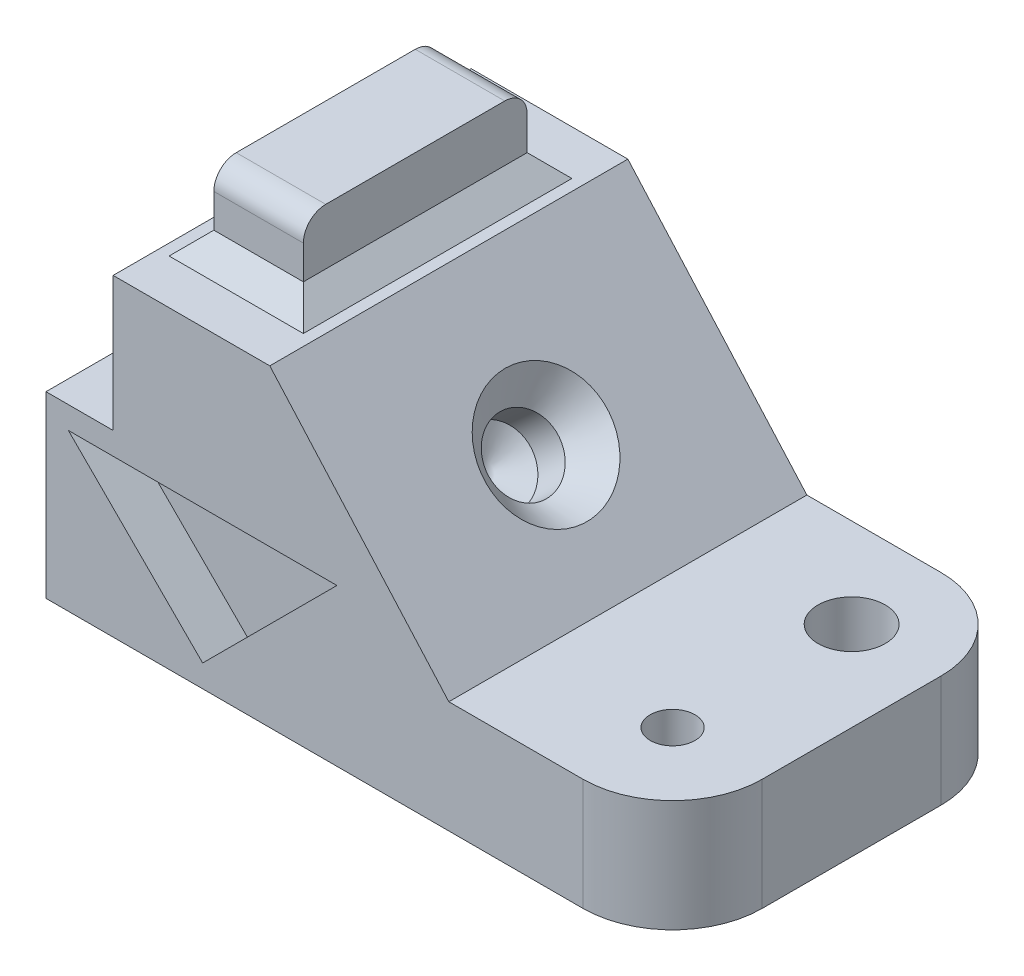
ISO-10303-21;
HEADER;
FILE_DESCRIPTION(('STEP AP214'),'2;1');
FILE_NAME('part.step','',(''),(''),'','','');
FILE_SCHEMA(('AUTOMOTIVE_DESIGN { 1 0 10303 214 1 1 1 1 }'));
ENDSEC;
DATA;
#1=APPLICATION_CONTEXT('core data for automotive mechanical design processes');
#2=APPLICATION_PROTOCOL_DEFINITION('international standard','automotive_design',2000,#1);
#3=PRODUCT_CONTEXT('',#1,'mechanical');
#4=PRODUCT('Part','Part','',(#3));
#5=PRODUCT_RELATED_PRODUCT_CATEGORY('part','',(#4));
#6=PRODUCT_DEFINITION_FORMATION('','',#4);
#7=PRODUCT_DEFINITION_CONTEXT('part definition',#1,'design');
#8=PRODUCT_DEFINITION('design','',#6,#7);
#9=PRODUCT_DEFINITION_SHAPE('','',#8);
#10=(LENGTH_UNIT() NAMED_UNIT(*) SI_UNIT(.MILLI.,.METRE.));
#11=(NAMED_UNIT(*) PLANE_ANGLE_UNIT() SI_UNIT($,.RADIAN.));
#12=(NAMED_UNIT(*) SI_UNIT($,.STERADIAN.) SOLID_ANGLE_UNIT());
#13=UNCERTAINTY_MEASURE_WITH_UNIT(LENGTH_MEASURE(1.E-05),#10,'distance_accuracy_value','');
#14=(GEOMETRIC_REPRESENTATION_CONTEXT(3) GLOBAL_UNCERTAINTY_ASSIGNED_CONTEXT((#13)) GLOBAL_UNIT_ASSIGNED_CONTEXT((#10,
#11,#12)) REPRESENTATION_CONTEXT('',''));
#15=CARTESIAN_POINT('',(0.,0.,0.));
#16=DIRECTION('',(0.,0.,1.));
#17=DIRECTION('',(1.,0.,0.));
#18=AXIS2_PLACEMENT_3D('',#15,#16,#17);
#19=CARTESIAN_POINT('',(177.8,0.,101.6));
#20=DIRECTION('',(0.,1.,0.));
#21=DIRECTION('',(-1.,0.,0.));
#22=AXIS2_PLACEMENT_3D('',#19,#20,#21);
#23=PLANE('',#22);
#24=CARTESIAN_POINT('',(152.4,0.,76.2));
#25=DIRECTION('',(0.,-1.,0.));
#26=DIRECTION('',(0.,0.,-1.));
#27=AXIS2_PLACEMENT_3D('',#24,#25,#26);
#28=CIRCLE('',#27,6.34999999999999);
#29=CARTESIAN_POINT('',(152.4,0.,69.85));
#30=VERTEX_POINT('',#29);
#31=EDGE_CURVE('E365',#30,#30,#28,.T.);
#32=ORIENTED_EDGE('',*,*,#31,.F.);
#33=EDGE_LOOP('',(#32));
#34=FACE_BOUND('',#33,.T.);
#35=CARTESIAN_POINT('',(152.4,0.,25.4));
#36=DIRECTION('',(0.,-1.,0.));
#37=DIRECTION('',(0.,0.,-1.));
#38=AXIS2_PLACEMENT_3D('',#35,#36,#37);
#39=CIRCLE('',#38,9.52499999999998);
#40=CARTESIAN_POINT('',(152.4,0.,15.875));
#41=VERTEX_POINT('',#40);
#42=EDGE_CURVE('E356',#41,#41,#39,.T.);
#43=ORIENTED_EDGE('',*,*,#42,.F.);
#44=EDGE_LOOP('',(#43));
#45=FACE_BOUND('',#44,.T.);
#46=DIRECTION('',(0.,0.,-1.));
#47=VECTOR('',#46,1.);
#48=CARTESIAN_POINT('',(177.8,0.,101.6));
#49=LINE('',#48,#47);
#50=CARTESIAN_POINT('',(177.8,0.,76.2));
#51=VERTEX_POINT('',#50);
#52=CARTESIAN_POINT('',(177.8,0.,25.4));
#53=VERTEX_POINT('',#52);
#54=EDGE_CURVE('E311',#51,#53,#49,.T.);
#55=ORIENTED_EDGE('',*,*,#54,.F.);
#56=CARTESIAN_POINT('',(152.4,0.,76.2));
#57=DIRECTION('',(0.,1.,0.));
#58=DIRECTION('',(-1.,0.,0.));
#59=AXIS2_PLACEMENT_3D('',#56,#57,#58);
#60=CIRCLE('',#59,25.4);
#61=CARTESIAN_POINT('',(152.4,0.,101.6));
#62=VERTEX_POINT('',#61);
#63=EDGE_CURVE('E49',#51,#62,#60,.F.);
#64=ORIENTED_EDGE('',*,*,#63,.T.);
#65=DIRECTION('',(1.,0.,0.));
#66=VECTOR('',#65,1.);
#67=CARTESIAN_POINT('',(177.8,0.,101.6));
#68=LINE('',#67,#66);
#69=CARTESIAN_POINT('',(0.,0.,101.6));
#70=VERTEX_POINT('',#69);
#71=EDGE_CURVE('E262',#70,#62,#68,.T.);
#72=ORIENTED_EDGE('',*,*,#71,.F.);
#73=DIRECTION('',(0.,0.,-1.));
#74=VECTOR('',#73,1.);
#75=CARTESIAN_POINT('',(0.,0.,101.6));
#76=LINE('',#75,#74);
#77=CARTESIAN_POINT('',(0.,0.,0.));
#78=VERTEX_POINT('',#77);
#79=EDGE_CURVE('E278',#70,#78,#76,.T.);
#80=ORIENTED_EDGE('',*,*,#79,.T.);
#81=DIRECTION('',(1.,0.,0.));
#82=VECTOR('',#81,1.);
#83=CARTESIAN_POINT('',(177.8,0.,0.));
#84=LINE('',#83,#82);
#85=CARTESIAN_POINT('',(152.4,0.,0.));
#86=VERTEX_POINT('',#85);
#87=EDGE_CURVE('E261',#78,#86,#84,.T.);
#88=ORIENTED_EDGE('',*,*,#87,.T.);
#89=CARTESIAN_POINT('',(152.4,0.,25.4));
#90=DIRECTION('',(0.,1.,0.));
#91=DIRECTION('',(-1.,0.,0.));
#92=AXIS2_PLACEMENT_3D('',#89,#90,#91);
#93=CIRCLE('',#92,25.4);
#94=EDGE_CURVE('E352',#86,#53,#93,.F.);
#95=ORIENTED_EDGE('',*,*,#94,.T.);
#96=EDGE_LOOP('',(#55,#64,#72,#80,#88,#95));
#97=FACE_BOUND('',#96,.T.);
#98=ADVANCED_FACE('F40',(#34,#45,#97),#23,.F.);
#99=CARTESIAN_POINT('',(177.8,31.75,101.6));
#100=DIRECTION('',(-1.,0.,0.));
#101=DIRECTION('',(0.,0.,1.));
#102=AXIS2_PLACEMENT_3D('',#99,#100,#101);
#103=PLANE('',#102);
#104=DIRECTION('',(0.,0.,-1.));
#105=VECTOR('',#104,1.);
#106=CARTESIAN_POINT('',(177.8,31.75,101.6));
#107=LINE('',#106,#105);
#108=CARTESIAN_POINT('',(177.8,31.75,76.2));
#109=VERTEX_POINT('',#108);
#110=CARTESIAN_POINT('',(177.8,31.75,25.4));
#111=VERTEX_POINT('',#110);
#112=EDGE_CURVE('E308',#109,#111,#107,.T.);
#113=ORIENTED_EDGE('',*,*,#112,.F.);
#114=DIRECTION('',(0.,1.,0.));
#115=VECTOR('',#114,1.);
#116=CARTESIAN_POINT('',(177.8,31.75,76.2));
#117=LINE('',#116,#115);
#118=EDGE_CURVE('E350',#109,#51,#117,.F.);
#119=ORIENTED_EDGE('',*,*,#118,.T.);
#120=ORIENTED_EDGE('',*,*,#54,.T.);
#121=DIRECTION('',(0.,1.,0.));
#122=VECTOR('',#121,1.);
#123=CARTESIAN_POINT('',(177.8,31.75,25.4));
#124=LINE('',#123,#122);
#125=EDGE_CURVE('E347',#53,#111,#124,.T.);
#126=ORIENTED_EDGE('',*,*,#125,.T.);
#127=EDGE_LOOP('',(#113,#119,#120,#126));
#128=FACE_BOUND('',#127,.T.);
#129=ADVANCED_FACE('F375',(#128),#103,.F.);
#130=CARTESIAN_POINT('',(114.3,31.75,101.6));
#131=DIRECTION('',(0.,-1.,0.));
#132=DIRECTION('',(0.,0.,-1.));
#133=AXIS2_PLACEMENT_3D('',#130,#131,#132);
#134=PLANE('',#133);
#135=CARTESIAN_POINT('',(152.4,31.75,76.2));
#136=DIRECTION('',(0.,-1.,0.));
#137=DIRECTION('',(0.,0.,-1.));
#138=AXIS2_PLACEMENT_3D('',#135,#136,#137);
#139=CIRCLE('',#138,6.34999999999999);
#140=CARTESIAN_POINT('',(152.4,31.75,69.85));
#141=VERTEX_POINT('',#140);
#142=EDGE_CURVE('E44',#141,#141,#139,.T.);
#143=ORIENTED_EDGE('',*,*,#142,.T.);
#144=EDGE_LOOP('',(#143));
#145=FACE_BOUND('',#144,.T.);
#146=CARTESIAN_POINT('',(152.4,31.75,25.4));
#147=DIRECTION('',(0.,-1.,0.));
#148=DIRECTION('',(0.,0.,-1.));
#149=AXIS2_PLACEMENT_3D('',#146,#147,#148);
#150=CIRCLE('',#149,9.52499999999998);
#151=CARTESIAN_POINT('',(152.4,31.75,15.875));
#152=VERTEX_POINT('',#151);
#153=EDGE_CURVE('E354',#152,#152,#150,.T.);
#154=ORIENTED_EDGE('',*,*,#153,.T.);
#155=EDGE_LOOP('',(#154));
#156=FACE_BOUND('',#155,.T.);
#157=DIRECTION('',(-1.,0.,0.));
#158=VECTOR('',#157,1.);
#159=CARTESIAN_POINT('',(114.3,31.75,101.6));
#160=LINE('',#159,#158);
#161=CARTESIAN_POINT('',(152.4,31.75,101.6));
#162=VERTEX_POINT('',#161);
#163=CARTESIAN_POINT('',(114.3,31.75,101.6));
#164=VERTEX_POINT('',#163);
#165=EDGE_CURVE('E265',#162,#164,#160,.T.);
#166=ORIENTED_EDGE('',*,*,#165,.F.);
#167=CARTESIAN_POINT('',(152.4,31.75,76.2));
#168=DIRECTION('',(0.,-1.,0.));
#169=DIRECTION('',(0.,0.,-1.));
#170=AXIS2_PLACEMENT_3D('',#167,#168,#169);
#171=CIRCLE('',#170,25.4);
#172=EDGE_CURVE('E345',#162,#109,#171,.F.);
#173=ORIENTED_EDGE('',*,*,#172,.T.);
#174=ORIENTED_EDGE('',*,*,#112,.T.);
#175=CARTESIAN_POINT('',(152.4,31.75,25.4));
#176=DIRECTION('',(0.,-1.,0.));
#177=DIRECTION('',(0.,0.,-1.));
#178=AXIS2_PLACEMENT_3D('',#175,#176,#177);
#179=CIRCLE('',#178,25.4);
#180=CARTESIAN_POINT('',(152.4,31.75,0.));
#181=VERTEX_POINT('',#180);
#182=EDGE_CURVE('E343',#111,#181,#179,.F.);
#183=ORIENTED_EDGE('',*,*,#182,.T.);
#184=DIRECTION('',(-1.,0.,0.));
#185=VECTOR('',#184,1.);
#186=CARTESIAN_POINT('',(114.3,31.75,0.));
#187=LINE('',#186,#185);
#188=CARTESIAN_POINT('',(114.3,31.75,0.));
#189=VERTEX_POINT('',#188);
#190=EDGE_CURVE('E280',#181,#189,#187,.T.);
#191=ORIENTED_EDGE('',*,*,#190,.T.);
#192=DIRECTION('',(0.,0.,-1.));
#193=VECTOR('',#192,1.);
#194=CARTESIAN_POINT('',(114.3,31.75,101.6));
#195=LINE('',#194,#193);
#196=EDGE_CURVE('E305',#164,#189,#195,.T.);
#197=ORIENTED_EDGE('',*,*,#196,.F.);
#198=EDGE_LOOP('',(#166,#173,#174,#183,#191,#197));
#199=FACE_BOUND('',#198,.T.);
#200=ADVANCED_FACE('F393',(#145,#156,#199),#134,.F.);
#201=CARTESIAN_POINT('',(63.5,88.9,101.6));
#202=DIRECTION('',(-0.74740931868366,-0.66436383882992,0.));
#203=DIRECTION('',(0.66436383882992,-0.74740931868366,0.));
#204=AXIS2_PLACEMENT_3D('',#201,#202,#203);
#205=PLANE('',#204);
#206=CARTESIAN_POINT('',(91.097092928865,57.8532704550268,50.8));
#207=DIRECTION('',(0.74740931868366,0.66436383882992,0.));
#208=DIRECTION('',(-0.66436383882992,0.74740931868366,0.));
#209=AXIS2_PLACEMENT_3D('',#206,#207,#208);
#210=CIRCLE('',#209,17.4625);
#211=CARTESIAN_POINT('',(79.4956393932976,70.9049056825402,50.8));
#212=VERTEX_POINT('',#211);
#213=EDGE_CURVE('E201',#212,#212,#210,.T.);
#214=ORIENTED_EDGE('',*,*,#213,.F.);
#215=EDGE_LOOP('',(#214));
#216=FACE_BOUND('',#215,.T.);
#217=DIRECTION('',(-0.66436383882992,0.74740931868366,0.));
#218=VECTOR('',#217,1.);
#219=CARTESIAN_POINT('',(63.5,88.9,0.));
#220=LINE('',#219,#218);
#221=CARTESIAN_POINT('',(63.5,88.9,0.));
#222=VERTEX_POINT('',#221);
#223=EDGE_CURVE('E282',#189,#222,#220,.T.);
#224=ORIENTED_EDGE('',*,*,#223,.T.);
#225=DIRECTION('',(0.,0.,-1.));
#226=VECTOR('',#225,1.);
#227=CARTESIAN_POINT('',(63.5,88.9,101.6));
#228=LINE('',#227,#226);
#229=CARTESIAN_POINT('',(63.5,88.9,101.6));
#230=VERTEX_POINT('',#229);
#231=EDGE_CURVE('E302',#230,#222,#228,.T.);
#232=ORIENTED_EDGE('',*,*,#231,.F.);
#233=DIRECTION('',(-0.66436383882992,0.74740931868366,0.));
#234=VECTOR('',#233,1.);
#235=CARTESIAN_POINT('',(63.5,88.9,101.6));
#236=LINE('',#235,#234);
#237=EDGE_CURVE('E268',#164,#230,#236,.T.);
#238=ORIENTED_EDGE('',*,*,#237,.F.);
#239=ORIENTED_EDGE('',*,*,#196,.T.);
#240=EDGE_LOOP('',(#224,#232,#238,#239));
#241=FACE_BOUND('',#240,.T.);
#242=ADVANCED_FACE('F399',(#216,#241),#205,.F.);
#243=CARTESIAN_POINT('',(19.05,88.9,101.6));
#244=DIRECTION('',(0.,-1.,0.));
#245=DIRECTION('',(1.,0.,0.));
#246=AXIS2_PLACEMENT_3D('',#243,#244,#245);
#247=PLANE('',#246);
#248=DIRECTION('',(-1.,0.,0.));
#249=VECTOR('',#248,1.);
#250=CARTESIAN_POINT('',(28.575,88.9,88.8999999999999));
#251=LINE('',#250,#249);
#252=CARTESIAN_POINT('',(60.3249999999999,88.9,88.8999999999999));
#253=VERTEX_POINT('',#252);
#254=CARTESIAN_POINT('',(22.2250000000001,88.9,88.8999999999999));
#255=VERTEX_POINT('',#254);
#256=EDGE_CURVE('E317',#253,#255,#251,.T.);
#257=ORIENTED_EDGE('',*,*,#256,.T.);
#258=DIRECTION('',(0.,0.,-1.));
#259=VECTOR('',#258,1.);
#260=CARTESIAN_POINT('',(22.2250000000001,88.9,101.6));
#261=LINE('',#260,#259);
#262=CARTESIAN_POINT('',(22.2250000000001,88.9,12.7000000000001));
#263=VERTEX_POINT('',#262);
#264=EDGE_CURVE('E323',#255,#263,#261,.T.);
#265=ORIENTED_EDGE('',*,*,#264,.T.);
#266=DIRECTION('',(1.,0.,0.));
#267=VECTOR('',#266,1.);
#268=CARTESIAN_POINT('',(53.975,88.9,12.7000000000001));
#269=LINE('',#268,#267);
#270=CARTESIAN_POINT('',(60.3249999999999,88.9,12.7000000000001));
#271=VERTEX_POINT('',#270);
#272=EDGE_CURVE('E321',#263,#271,#269,.T.);
#273=ORIENTED_EDGE('',*,*,#272,.T.);
#274=DIRECTION('',(0.,0.,1.));
#275=VECTOR('',#274,1.);
#276=CARTESIAN_POINT('',(60.3249999999999,88.9,82.55));
#277=LINE('',#276,#275);
#278=EDGE_CURVE('E319',#271,#253,#277,.T.);
#279=ORIENTED_EDGE('',*,*,#278,.T.);
#280=EDGE_LOOP('',(#257,#265,#273,#279));
#281=FACE_BOUND('',#280,.T.);
#282=DIRECTION('',(-1.,0.,0.));
#283=VECTOR('',#282,1.);
#284=CARTESIAN_POINT('',(19.05,88.9,0.));
#285=LINE('',#284,#283);
#286=CARTESIAN_POINT('',(19.05,88.9,0.));
#287=VERTEX_POINT('',#286);
#288=EDGE_CURVE('E284',#222,#287,#285,.T.);
#289=ORIENTED_EDGE('',*,*,#288,.T.);
#290=DIRECTION('',(0.,0.,-1.));
#291=VECTOR('',#290,1.);
#292=CARTESIAN_POINT('',(19.05,88.9,101.6));
#293=LINE('',#292,#291);
#294=CARTESIAN_POINT('',(19.05,88.9,101.6));
#295=VERTEX_POINT('',#294);
#296=EDGE_CURVE('E299',#295,#287,#293,.T.);
#297=ORIENTED_EDGE('',*,*,#296,.F.);
#298=DIRECTION('',(-1.,0.,0.));
#299=VECTOR('',#298,1.);
#300=CARTESIAN_POINT('',(19.05,88.9,101.6));
#301=LINE('',#300,#299);
#302=EDGE_CURVE('E270',#230,#295,#301,.T.);
#303=ORIENTED_EDGE('',*,*,#302,.F.);
#304=ORIENTED_EDGE('',*,*,#231,.T.);
#305=EDGE_LOOP('',(#289,#297,#303,#304));
#306=FACE_BOUND('',#305,.T.);
#307=ADVANCED_FACE('F405',(#281,#306),#247,.F.);
#308=CARTESIAN_POINT('',(19.05,50.8,101.6));
#309=DIRECTION('',(1.,0.,0.));
#310=DIRECTION('',(0.,0.,-1.));
#311=AXIS2_PLACEMENT_3D('',#308,#309,#310);
#312=PLANE('',#311);
#313=DIRECTION('',(0.,-1.,0.));
#314=VECTOR('',#313,1.);
#315=CARTESIAN_POINT('',(19.05,50.8,0.));
#316=LINE('',#315,#314);
#317=CARTESIAN_POINT('',(19.05,50.8,0.));
#318=VERTEX_POINT('',#317);
#319=EDGE_CURVE('E286',#287,#318,#316,.T.);
#320=ORIENTED_EDGE('',*,*,#319,.T.);
#321=DIRECTION('',(0.,0.,-1.));
#322=VECTOR('',#321,1.);
#323=CARTESIAN_POINT('',(19.05,50.8,101.6));
#324=LINE('',#323,#322);
#325=CARTESIAN_POINT('',(19.05,50.8,101.6));
#326=VERTEX_POINT('',#325);
#327=EDGE_CURVE('E296',#326,#318,#324,.T.);
#328=ORIENTED_EDGE('',*,*,#327,.F.);
#329=DIRECTION('',(0.,-1.,0.));
#330=VECTOR('',#329,1.);
#331=CARTESIAN_POINT('',(19.05,50.8,101.6));
#332=LINE('',#331,#330);
#333=EDGE_CURVE('E272',#295,#326,#332,.T.);
#334=ORIENTED_EDGE('',*,*,#333,.F.);
#335=ORIENTED_EDGE('',*,*,#296,.T.);
#336=EDGE_LOOP('',(#320,#328,#334,#335));
#337=FACE_BOUND('',#336,.T.);
#338=ADVANCED_FACE('F409',(#337),#312,.F.);
#339=CARTESIAN_POINT('',(0.,50.8,101.6));
#340=DIRECTION('',(0.,-1.,0.));
#341=DIRECTION('',(0.,0.,-1.));
#342=AXIS2_PLACEMENT_3D('',#339,#340,#341);
#343=PLANE('',#342);
#344=DIRECTION('',(-1.,0.,0.));
#345=VECTOR('',#344,1.);
#346=CARTESIAN_POINT('',(0.,50.8,0.));
#347=LINE('',#346,#345);
#348=CARTESIAN_POINT('',(0.,50.8,0.));
#349=VERTEX_POINT('',#348);
#350=EDGE_CURVE('E288',#318,#349,#347,.T.);
#351=ORIENTED_EDGE('',*,*,#350,.T.);
#352=DIRECTION('',(0.,0.,-1.));
#353=VECTOR('',#352,1.);
#354=CARTESIAN_POINT('',(0.,50.8,101.6));
#355=LINE('',#354,#353);
#356=CARTESIAN_POINT('',(0.,50.8,101.6));
#357=VERTEX_POINT('',#356);
#358=EDGE_CURVE('E293',#357,#349,#355,.T.);
#359=ORIENTED_EDGE('',*,*,#358,.F.);
#360=DIRECTION('',(-1.,0.,0.));
#361=VECTOR('',#360,1.);
#362=CARTESIAN_POINT('',(0.,50.8,101.6));
#363=LINE('',#362,#361);
#364=EDGE_CURVE('E274',#326,#357,#363,.T.);
#365=ORIENTED_EDGE('',*,*,#364,.F.);
#366=ORIENTED_EDGE('',*,*,#327,.T.);
#367=EDGE_LOOP('',(#351,#359,#365,#366));
#368=FACE_BOUND('',#367,.T.);
#369=ADVANCED_FACE('F414',(#368),#343,.F.);
#370=CARTESIAN_POINT('',(0.,0.,101.6));
#371=DIRECTION('',(1.,0.,0.));
#372=DIRECTION('',(0.,0.,-1.));
#373=AXIS2_PLACEMENT_3D('',#370,#371,#372);
#374=PLANE('',#373);
#375=DIRECTION('',(0.,-1.,0.));
#376=VECTOR('',#375,1.);
#377=CARTESIAN_POINT('',(0.,0.,0.));
#378=LINE('',#377,#376);
#379=EDGE_CURVE('E266',#349,#78,#378,.T.);
#380=ORIENTED_EDGE('',*,*,#379,.T.);
#381=ORIENTED_EDGE('',*,*,#79,.F.);
#382=DIRECTION('',(0.,-1.,0.));
#383=VECTOR('',#382,1.);
#384=CARTESIAN_POINT('',(0.,0.,101.6));
#385=LINE('',#384,#383);
#386=EDGE_CURVE('E276',#357,#70,#385,.T.);
#387=ORIENTED_EDGE('',*,*,#386,.F.);
#388=ORIENTED_EDGE('',*,*,#358,.T.);
#389=EDGE_LOOP('',(#380,#381,#387,#388));
#390=FACE_BOUND('',#389,.T.);
#391=ADVANCED_FACE('F418',(#390),#374,.F.);
#392=CARTESIAN_POINT('',(0.,0.,101.6));
#393=DIRECTION('',(0.,0.,-1.));
#394=DIRECTION('',(-1.,0.,0.));
#395=AXIS2_PLACEMENT_3D('',#392,#393,#394);
#396=PLANE('',#395);
#397=DIRECTION('',(0.707106781186548,0.707106781186548,0.));
#398=VECTOR('',#397,1.);
#399=CARTESIAN_POINT('',(82.55,44.45,101.6));
#400=LINE('',#399,#398);
#401=CARTESIAN_POINT('',(44.45,6.35,101.6));
#402=VERTEX_POINT('',#401);
#403=CARTESIAN_POINT('',(82.55,44.45,101.6));
#404=VERTEX_POINT('',#403);
#405=EDGE_CURVE('E198',#402,#404,#400,.T.);
#406=ORIENTED_EDGE('',*,*,#405,.F.);
#407=DIRECTION('',(0.707106781186547,-0.707106781186547,0.));
#408=VECTOR('',#407,1.);
#409=CARTESIAN_POINT('',(44.45,6.35,101.6));
#410=LINE('',#409,#408);
#411=CARTESIAN_POINT('',(6.35,44.45,101.6));
#412=VERTEX_POINT('',#411);
#413=EDGE_CURVE('E57',#412,#402,#410,.T.);
#414=ORIENTED_EDGE('',*,*,#413,.F.);
#415=DIRECTION('',(-1.,0.,0.));
#416=VECTOR('',#415,1.);
#417=CARTESIAN_POINT('',(6.35,44.45,101.6));
#418=LINE('',#417,#416);
#419=EDGE_CURVE('E209',#404,#412,#418,.T.);
#420=ORIENTED_EDGE('',*,*,#419,.F.);
#421=EDGE_LOOP('',(#406,#414,#420));
#422=FACE_BOUND('',#421,.T.);
#423=ORIENTED_EDGE('',*,*,#71,.T.);
#424=DIRECTION('',(0.,1.,0.));
#425=VECTOR('',#424,1.);
#426=CARTESIAN_POINT('',(152.4,0.,101.6));
#427=LINE('',#426,#425);
#428=EDGE_CURVE('E332',#62,#162,#427,.T.);
#429=ORIENTED_EDGE('',*,*,#428,.T.);
#430=ORIENTED_EDGE('',*,*,#165,.T.);
#431=ORIENTED_EDGE('',*,*,#237,.T.);
#432=ORIENTED_EDGE('',*,*,#302,.T.);
#433=ORIENTED_EDGE('',*,*,#333,.T.);
#434=ORIENTED_EDGE('',*,*,#364,.T.);
#435=ORIENTED_EDGE('',*,*,#386,.T.);
#436=EDGE_LOOP('',(#423,#429,#430,#431,#432,#433,#434,#435));
#437=FACE_BOUND('',#436,.T.);
#438=ADVANCED_FACE('F390',(#422,#437),#396,.F.);
#439=CARTESIAN_POINT('',(0.,0.,0.));
#440=DIRECTION('',(0.,0.,-1.));
#441=DIRECTION('',(-1.,0.,0.));
#442=AXIS2_PLACEMENT_3D('',#439,#440,#441);
#443=PLANE('',#442);
#444=ORIENTED_EDGE('',*,*,#190,.F.);
#445=DIRECTION('',(0.,1.,0.));
#446=VECTOR('',#445,1.);
#447=CARTESIAN_POINT('',(152.4,0.,0.));
#448=LINE('',#447,#446);
#449=EDGE_CURVE('E11',#181,#86,#448,.F.);
#450=ORIENTED_EDGE('',*,*,#449,.T.);
#451=ORIENTED_EDGE('',*,*,#87,.F.);
#452=ORIENTED_EDGE('',*,*,#379,.F.);
#453=ORIENTED_EDGE('',*,*,#350,.F.);
#454=ORIENTED_EDGE('',*,*,#319,.F.);
#455=ORIENTED_EDGE('',*,*,#288,.F.);
#456=ORIENTED_EDGE('',*,*,#223,.F.);
#457=EDGE_LOOP('',(#444,#450,#451,#452,#453,#454,#455,#456));
#458=FACE_BOUND('',#457,.T.);
#459=ADVANCED_FACE('F420',(#458),#443,.T.);
#460=CARTESIAN_POINT('',(28.575,104.775,82.55));
#461=DIRECTION('',(0.,0.,-1.));
#462=DIRECTION('',(-1.,0.,0.));
#463=AXIS2_PLACEMENT_3D('',#460,#461,#462);
#464=PLANE('',#463);
#465=DIRECTION('',(0.,1.,0.));
#466=VECTOR('',#465,1.);
#467=CARTESIAN_POINT('',(28.575,104.775,82.55));
#468=LINE('',#467,#466);
#469=CARTESIAN_POINT('',(28.575,95.25,82.55));
#470=VERTEX_POINT('',#469);
#471=CARTESIAN_POINT('',(28.575,104.775,82.55));
#472=VERTEX_POINT('',#471);
#473=EDGE_CURVE('E226',#470,#472,#468,.T.);
#474=ORIENTED_EDGE('',*,*,#473,.F.);
#475=DIRECTION('',(1.,0.,0.));
#476=VECTOR('',#475,1.);
#477=CARTESIAN_POINT('',(53.975,95.25,82.55));
#478=LINE('',#477,#476);
#479=CARTESIAN_POINT('',(53.975,95.25,82.55));
#480=VERTEX_POINT('',#479);
#481=EDGE_CURVE('E330',#470,#480,#478,.T.);
#482=ORIENTED_EDGE('',*,*,#481,.T.);
#483=DIRECTION('',(0.,1.,0.));
#484=VECTOR('',#483,1.);
#485=CARTESIAN_POINT('',(53.975,104.775,82.55));
#486=LINE('',#485,#484);
#487=CARTESIAN_POINT('',(53.975,104.775,82.55));
#488=VERTEX_POINT('',#487);
#489=EDGE_CURVE('E239',#480,#488,#486,.T.);
#490=ORIENTED_EDGE('',*,*,#489,.T.);
#491=DIRECTION('',(1.,0.,0.));
#492=VECTOR('',#491,1.);
#493=CARTESIAN_POINT('',(28.575,104.775,82.55));
#494=LINE('',#493,#492);
#495=EDGE_CURVE('E258',#472,#488,#494,.T.);
#496=ORIENTED_EDGE('',*,*,#495,.F.);
#497=EDGE_LOOP('',(#474,#482,#490,#496));
#498=FACE_BOUND('',#497,.T.);
#499=ADVANCED_FACE('F499',(#498),#464,.F.);
#500=CARTESIAN_POINT('',(28.575,104.775,76.2));
#501=DIRECTION('',(1.,0.,0.));
#502=DIRECTION('',(0.,0.,-1.));
#503=AXIS2_PLACEMENT_3D('',#500,#501,#502);
#504=CYLINDRICAL_SURFACE('',#503,6.34999999999999);
#505=CARTESIAN_POINT('',(53.975,104.775,76.2));
#506=DIRECTION('',(-1.,0.,0.));
#507=DIRECTION('',(0.,0.,-1.));
#508=AXIS2_PLACEMENT_3D('',#505,#506,#507);
#509=CIRCLE('',#508,6.34999999999999);
#510=CARTESIAN_POINT('',(53.975,111.125,76.2));
#511=VERTEX_POINT('',#510);
#512=EDGE_CURVE('E241',#488,#511,#509,.T.);
#513=ORIENTED_EDGE('',*,*,#512,.T.);
#514=DIRECTION('',(1.,0.,0.));
#515=VECTOR('',#514,1.);
#516=CARTESIAN_POINT('',(28.575,111.125,76.2));
#517=LINE('',#516,#515);
#518=CARTESIAN_POINT('',(28.575,111.125,76.2));
#519=VERTEX_POINT('',#518);
#520=EDGE_CURVE('E255',#519,#511,#517,.T.);
#521=ORIENTED_EDGE('',*,*,#520,.F.);
#522=CARTESIAN_POINT('',(28.575,104.775,76.2));
#523=DIRECTION('',(-1.,0.,0.));
#524=DIRECTION('',(0.,0.,-1.));
#525=AXIS2_PLACEMENT_3D('',#522,#523,#524);
#526=CIRCLE('',#525,6.34999999999999);
#527=EDGE_CURVE('E228',#472,#519,#526,.T.);
#528=ORIENTED_EDGE('',*,*,#527,.F.);
#529=ORIENTED_EDGE('',*,*,#495,.T.);
#530=EDGE_LOOP('',(#513,#521,#528,#529));
#531=FACE_BOUND('',#530,.T.);
#532=ADVANCED_FACE('F495',(#531),#504,.T.);
#533=CARTESIAN_POINT('',(28.575,111.125,25.4));
#534=DIRECTION('',(0.,-1.,0.));
#535=DIRECTION('',(0.,0.,-1.));
#536=AXIS2_PLACEMENT_3D('',#533,#534,#535);
#537=PLANE('',#536);
#538=DIRECTION('',(0.,0.,-1.));
#539=VECTOR('',#538,1.);
#540=CARTESIAN_POINT('',(53.975,111.125,25.4));
#541=LINE('',#540,#539);
#542=CARTESIAN_POINT('',(53.975,111.125,25.4));
#543=VERTEX_POINT('',#542);
#544=EDGE_CURVE('E244',#511,#543,#541,.T.);
#545=ORIENTED_EDGE('',*,*,#544,.T.);
#546=DIRECTION('',(1.,0.,0.));
#547=VECTOR('',#546,1.);
#548=CARTESIAN_POINT('',(28.575,111.125,25.4));
#549=LINE('',#548,#547);
#550=CARTESIAN_POINT('',(28.575,111.125,25.4));
#551=VERTEX_POINT('',#550);
#552=EDGE_CURVE('E252',#551,#543,#549,.T.);
#553=ORIENTED_EDGE('',*,*,#552,.F.);
#554=DIRECTION('',(0.,0.,-1.));
#555=VECTOR('',#554,1.);
#556=CARTESIAN_POINT('',(28.575,111.125,25.4));
#557=LINE('',#556,#555);
#558=EDGE_CURVE('E231',#519,#551,#557,.T.);
#559=ORIENTED_EDGE('',*,*,#558,.F.);
#560=ORIENTED_EDGE('',*,*,#520,.T.);
#561=EDGE_LOOP('',(#545,#553,#559,#560));
#562=FACE_BOUND('',#561,.T.);
#563=ADVANCED_FACE('F491',(#562),#537,.F.);
#564=CARTESIAN_POINT('',(28.575,104.775,25.4));
#565=DIRECTION('',(1.,0.,0.));
#566=DIRECTION('',(0.,0.,-1.));
#567=AXIS2_PLACEMENT_3D('',#564,#565,#566);
#568=CYLINDRICAL_SURFACE('',#567,6.34999999999999);
#569=CARTESIAN_POINT('',(53.975,104.775,25.4));
#570=DIRECTION('',(-1.,0.,0.));
#571=DIRECTION('',(0.,0.,1.));
#572=AXIS2_PLACEMENT_3D('',#569,#570,#571);
#573=CIRCLE('',#572,6.34999999999999);
#574=CARTESIAN_POINT('',(53.975,104.775,19.05));
#575=VERTEX_POINT('',#574);
#576=EDGE_CURVE('E246',#543,#575,#573,.T.);
#577=ORIENTED_EDGE('',*,*,#576,.T.);
#578=DIRECTION('',(1.,0.,0.));
#579=VECTOR('',#578,1.);
#580=CARTESIAN_POINT('',(28.575,104.775,19.05));
#581=LINE('',#580,#579);
#582=CARTESIAN_POINT('',(28.575,104.775,19.05));
#583=VERTEX_POINT('',#582);
#584=EDGE_CURVE('E238',#583,#575,#581,.T.);
#585=ORIENTED_EDGE('',*,*,#584,.F.);
#586=CARTESIAN_POINT('',(28.575,104.775,25.4));
#587=DIRECTION('',(-1.,0.,0.));
#588=DIRECTION('',(0.,0.,1.));
#589=AXIS2_PLACEMENT_3D('',#586,#587,#588);
#590=CIRCLE('',#589,6.34999999999999);
#591=EDGE_CURVE('E233',#551,#583,#590,.T.);
#592=ORIENTED_EDGE('',*,*,#591,.F.);
#593=ORIENTED_EDGE('',*,*,#552,.T.);
#594=EDGE_LOOP('',(#577,#585,#592,#593));
#595=FACE_BOUND('',#594,.T.);
#596=ADVANCED_FACE('F487',(#595),#568,.T.);
#597=CARTESIAN_POINT('',(28.575,104.775,19.05));
#598=DIRECTION('',(0.,0.,1.));
#599=DIRECTION('',(1.,0.,0.));
#600=AXIS2_PLACEMENT_3D('',#597,#598,#599);
#601=PLANE('',#600);
#602=DIRECTION('',(0.,-1.,0.));
#603=VECTOR('',#602,1.);
#604=CARTESIAN_POINT('',(53.975,104.775,19.05));
#605=LINE('',#604,#603);
#606=CARTESIAN_POINT('',(53.975,95.25,19.05));
#607=VERTEX_POINT('',#606);
#608=EDGE_CURVE('E229',#575,#607,#605,.T.);
#609=ORIENTED_EDGE('',*,*,#608,.T.);
#610=DIRECTION('',(-1.,0.,0.));
#611=VECTOR('',#610,1.);
#612=CARTESIAN_POINT('',(28.575,95.25,19.05));
#613=LINE('',#612,#611);
#614=CARTESIAN_POINT('',(28.575,95.25,19.05));
#615=VERTEX_POINT('',#614);
#616=EDGE_CURVE('E326',#607,#615,#613,.T.);
#617=ORIENTED_EDGE('',*,*,#616,.T.);
#618=DIRECTION('',(0.,-1.,0.));
#619=VECTOR('',#618,1.);
#620=CARTESIAN_POINT('',(28.575,104.775,19.05));
#621=LINE('',#620,#619);
#622=EDGE_CURVE('E235',#583,#615,#621,.T.);
#623=ORIENTED_EDGE('',*,*,#622,.F.);
#624=ORIENTED_EDGE('',*,*,#584,.T.);
#625=EDGE_LOOP('',(#609,#617,#623,#624));
#626=FACE_BOUND('',#625,.T.);
#627=ADVANCED_FACE('F480',(#626),#601,.F.);
#628=CARTESIAN_POINT('',(28.575,104.775,25.4));
#629=DIRECTION('',(-1.,0.,0.));
#630=DIRECTION('',(0.,0.,1.));
#631=AXIS2_PLACEMENT_3D('',#628,#629,#630);
#632=PLANE('',#631);
#633=ORIENTED_EDGE('',*,*,#622,.T.);
#634=DIRECTION('',(0.,0.,1.));
#635=VECTOR('',#634,1.);
#636=CARTESIAN_POINT('',(28.575,95.25,25.4));
#637=LINE('',#636,#635);
#638=EDGE_CURVE('E314',#615,#470,#637,.T.);
#639=ORIENTED_EDGE('',*,*,#638,.T.);
#640=ORIENTED_EDGE('',*,*,#473,.T.);
#641=ORIENTED_EDGE('',*,*,#527,.T.);
#642=ORIENTED_EDGE('',*,*,#558,.T.);
#643=ORIENTED_EDGE('',*,*,#591,.T.);
#644=EDGE_LOOP('',(#633,#639,#640,#641,#642,#643));
#645=FACE_BOUND('',#644,.T.);
#646=ADVANCED_FACE('F477',(#645),#632,.T.);
#647=CARTESIAN_POINT('',(53.975,104.775,25.4));
#648=DIRECTION('',(-1.,0.,0.));
#649=DIRECTION('',(0.,0.,1.));
#650=AXIS2_PLACEMENT_3D('',#647,#648,#649);
#651=PLANE('',#650);
#652=ORIENTED_EDGE('',*,*,#489,.F.);
#653=DIRECTION('',(0.,0.,-1.));
#654=VECTOR('',#653,1.);
#655=CARTESIAN_POINT('',(53.975,95.25,19.05));
#656=LINE('',#655,#654);
#657=EDGE_CURVE('E328',#480,#607,#656,.T.);
#658=ORIENTED_EDGE('',*,*,#657,.T.);
#659=ORIENTED_EDGE('',*,*,#608,.F.);
#660=ORIENTED_EDGE('',*,*,#576,.F.);
#661=ORIENTED_EDGE('',*,*,#544,.F.);
#662=ORIENTED_EDGE('',*,*,#512,.F.);
#663=EDGE_LOOP('',(#652,#658,#659,#660,#661,#662));
#664=FACE_BOUND('',#663,.T.);
#665=ADVANCED_FACE('F457',(#664),#651,.F.);
#666=CARTESIAN_POINT('',(60.3249999999999,88.9,101.6));
#667=DIRECTION('',(0.707106781186551,0.707106781186544,0.));
#668=DIRECTION('',(0.,0.,-1.));
#669=AXIS2_PLACEMENT_3D('',#666,#667,#668);
#670=PLANE('',#669);
#671=DIRECTION('',(-0.577350269189624,0.577350269189629,-0.577350269189624));
#672=VECTOR('',#671,1.);
#673=CARTESIAN_POINT('',(45.5083333333334,103.716666666667,74.0833333333334));
#674=LINE('',#673,#672);
#675=EDGE_CURVE('E336',#253,#480,#674,.T.);
#676=ORIENTED_EDGE('',*,*,#675,.F.);
#677=ORIENTED_EDGE('',*,*,#278,.F.);
#678=DIRECTION('',(-0.577350269189624,0.577350269189629,0.577350269189624));
#679=VECTOR('',#678,1.);
#680=CARTESIAN_POINT('',(30.6916666666668,118.533333333333,42.3333333333332));
#681=LINE('',#680,#679);
#682=EDGE_CURVE('E242',#607,#271,#681,.F.);
#683=ORIENTED_EDGE('',*,*,#682,.F.);
#684=ORIENTED_EDGE('',*,*,#657,.F.);
#685=EDGE_LOOP('',(#676,#677,#683,#684));
#686=FACE_BOUND('',#685,.T.);
#687=ADVANCED_FACE('F452',(#686),#670,.T.);
#688=CARTESIAN_POINT('',(19.05,88.9,12.7000000000001));
#689=DIRECTION('',(0.,0.707106781186544,-0.707106781186551));
#690=DIRECTION('',(-1.,0.,0.));
#691=AXIS2_PLACEMENT_3D('',#688,#689,#690);
#692=PLANE('',#691);
#693=ORIENTED_EDGE('',*,*,#682,.T.);
#694=ORIENTED_EDGE('',*,*,#272,.F.);
#695=DIRECTION('',(-0.577350269189624,-0.577350269189629,-0.577350269189624));
#696=VECTOR('',#695,1.);
#697=CARTESIAN_POINT('',(21.1666666666667,87.8416666666666,11.6416666666667));
#698=LINE('',#697,#696);
#699=EDGE_CURVE('E334',#615,#263,#698,.T.);
#700=ORIENTED_EDGE('',*,*,#699,.F.);
#701=ORIENTED_EDGE('',*,*,#616,.F.);
#702=EDGE_LOOP('',(#693,#694,#700,#701));
#703=FACE_BOUND('',#702,.T.);
#704=ADVANCED_FACE('F445',(#703),#692,.T.);
#705=CARTESIAN_POINT('',(28.575,95.25,82.55));
#706=DIRECTION('',(0.,0.707106781186544,0.707106781186551));
#707=DIRECTION('',(-1.,0.,0.));
#708=AXIS2_PLACEMENT_3D('',#705,#706,#707);
#709=PLANE('',#708);
#710=ORIENTED_EDGE('',*,*,#675,.T.);
#711=ORIENTED_EDGE('',*,*,#481,.F.);
#712=DIRECTION('',(0.577350269189624,0.577350269189629,-0.577350269189624));
#713=VECTOR('',#712,1.);
#714=CARTESIAN_POINT('',(28.575,95.25,82.55));
#715=LINE('',#714,#713);
#716=EDGE_CURVE('E222',#255,#470,#715,.T.);
#717=ORIENTED_EDGE('',*,*,#716,.F.);
#718=ORIENTED_EDGE('',*,*,#256,.F.);
#719=EDGE_LOOP('',(#710,#711,#717,#718));
#720=FACE_BOUND('',#719,.T.);
#721=ADVANCED_FACE('F438',(#720),#709,.T.);
#722=CARTESIAN_POINT('',(28.575,95.25,25.4));
#723=DIRECTION('',(0.70710678118655,-0.707106781186545,0.));
#724=DIRECTION('',(0.,0.,1.));
#725=AXIS2_PLACEMENT_3D('',#722,#723,#724);
#726=PLANE('',#725);
#727=ORIENTED_EDGE('',*,*,#699,.T.);
#728=ORIENTED_EDGE('',*,*,#264,.F.);
#729=ORIENTED_EDGE('',*,*,#716,.T.);
#730=ORIENTED_EDGE('',*,*,#638,.F.);
#731=EDGE_LOOP('',(#727,#728,#729,#730));
#732=FACE_BOUND('',#731,.T.);
#733=ADVANCED_FACE('F432',(#732),#726,.F.);
#734=CARTESIAN_POINT('',(152.4,0.,76.2));
#735=DIRECTION('',(0.,1.,0.));
#736=DIRECTION('',(0.,0.,1.));
#737=AXIS2_PLACEMENT_3D('',#734,#735,#736);
#738=CYLINDRICAL_SURFACE('',#737,25.4);
#739=ORIENTED_EDGE('',*,*,#63,.F.);
#740=ORIENTED_EDGE('',*,*,#118,.F.);
#741=ORIENTED_EDGE('',*,*,#172,.F.);
#742=ORIENTED_EDGE('',*,*,#428,.F.);
#743=EDGE_LOOP('',(#739,#740,#741,#742));
#744=FACE_BOUND('',#743,.T.);
#745=ADVANCED_FACE('F387',(#744),#738,.T.);
#746=CARTESIAN_POINT('',(152.4,31.75,25.4));
#747=DIRECTION('',(0.,-1.,0.));
#748=DIRECTION('',(0.,0.,-1.));
#749=AXIS2_PLACEMENT_3D('',#746,#747,#748);
#750=CYLINDRICAL_SURFACE('',#749,25.4);
#751=ORIENTED_EDGE('',*,*,#94,.F.);
#752=ORIENTED_EDGE('',*,*,#449,.F.);
#753=ORIENTED_EDGE('',*,*,#182,.F.);
#754=ORIENTED_EDGE('',*,*,#125,.F.);
#755=EDGE_LOOP('',(#751,#752,#753,#754));
#756=FACE_BOUND('',#755,.T.);
#757=ADVANCED_FACE('F42',(#756),#750,.T.);
#758=CARTESIAN_POINT('',(44.45,6.35,88.9));
#759=DIRECTION('',(-0.707106781186548,-0.707106781186548,0.));
#760=DIRECTION('',(0.707106781186548,-0.707106781186547,0.));
#761=AXIS2_PLACEMENT_3D('',#758,#759,#760);
#762=PLANE('',#761);
#763=ORIENTED_EDGE('',*,*,#413,.T.);
#764=DIRECTION('',(0.,0.,1.));
#765=VECTOR('',#764,1.);
#766=CARTESIAN_POINT('',(44.45,6.35,88.9));
#767=LINE('',#766,#765);
#768=CARTESIAN_POINT('',(44.45,6.35,88.9));
#769=VERTEX_POINT('',#768);
#770=EDGE_CURVE('E214',#769,#402,#767,.T.);
#771=ORIENTED_EDGE('',*,*,#770,.F.);
#772=DIRECTION('',(0.707106781186547,-0.707106781186547,0.));
#773=VECTOR('',#772,1.);
#774=CARTESIAN_POINT('',(44.45,6.35,88.9));
#775=LINE('',#774,#773);
#776=CARTESIAN_POINT('',(6.35,44.45,88.9));
#777=VERTEX_POINT('',#776);
#778=EDGE_CURVE('E205',#777,#769,#775,.T.);
#779=ORIENTED_EDGE('',*,*,#778,.F.);
#780=DIRECTION('',(0.,0.,1.));
#781=VECTOR('',#780,1.);
#782=CARTESIAN_POINT('',(6.35,44.45,88.9));
#783=LINE('',#782,#781);
#784=EDGE_CURVE('E220',#777,#412,#783,.T.);
#785=ORIENTED_EDGE('',*,*,#784,.T.);
#786=EDGE_LOOP('',(#763,#771,#779,#785));
#787=FACE_BOUND('',#786,.T.);
#788=ADVANCED_FACE('F463',(#787),#762,.F.);
#789=CARTESIAN_POINT('',(6.35,44.45,88.9));
#790=DIRECTION('',(0.,1.,0.));
#791=DIRECTION('',(0.,0.,1.));
#792=AXIS2_PLACEMENT_3D('',#789,#790,#791);
#793=PLANE('',#792);
#794=ORIENTED_EDGE('',*,*,#419,.T.);
#795=ORIENTED_EDGE('',*,*,#784,.F.);
#796=DIRECTION('',(-1.,0.,0.));
#797=VECTOR('',#796,1.);
#798=CARTESIAN_POINT('',(6.35,44.45,88.9));
#799=LINE('',#798,#797);
#800=CARTESIAN_POINT('',(82.55,44.45,88.9));
#801=VERTEX_POINT('',#800);
#802=EDGE_CURVE('E212',#801,#777,#799,.T.);
#803=ORIENTED_EDGE('',*,*,#802,.F.);
#804=DIRECTION('',(0.,0.,1.));
#805=VECTOR('',#804,1.);
#806=CARTESIAN_POINT('',(82.55,44.45,88.9));
#807=LINE('',#806,#805);
#808=EDGE_CURVE('E223',#801,#404,#807,.T.);
#809=ORIENTED_EDGE('',*,*,#808,.T.);
#810=EDGE_LOOP('',(#794,#795,#803,#809));
#811=FACE_BOUND('',#810,.T.);
#812=ADVANCED_FACE('F467',(#811),#793,.F.);
#813=CARTESIAN_POINT('',(82.55,44.45,88.9));
#814=DIRECTION('',(0.707106781186548,-0.707106781186548,0.));
#815=DIRECTION('',(0.707106781186548,0.707106781186548,0.));
#816=AXIS2_PLACEMENT_3D('',#813,#814,#815);
#817=PLANE('',#816);
#818=ORIENTED_EDGE('',*,*,#405,.T.);
#819=ORIENTED_EDGE('',*,*,#808,.F.);
#820=DIRECTION('',(0.707106781186548,0.707106781186548,0.));
#821=VECTOR('',#820,1.);
#822=CARTESIAN_POINT('',(82.55,44.45,88.9));
#823=LINE('',#822,#821);
#824=EDGE_CURVE('E208',#769,#801,#823,.T.);
#825=ORIENTED_EDGE('',*,*,#824,.F.);
#826=ORIENTED_EDGE('',*,*,#770,.T.);
#827=EDGE_LOOP('',(#818,#819,#825,#826));
#828=FACE_BOUND('',#827,.T.);
#829=ADVANCED_FACE('F472',(#828),#817,.F.);
#830=CARTESIAN_POINT('',(0.,0.,88.9));
#831=DIRECTION('',(0.,0.,1.));
#832=DIRECTION('',(1.,0.,0.));
#833=AXIS2_PLACEMENT_3D('',#830,#831,#832);
#834=PLANE('',#833);
#835=ORIENTED_EDGE('',*,*,#778,.T.);
#836=ORIENTED_EDGE('',*,*,#824,.T.);
#837=ORIENTED_EDGE('',*,*,#802,.T.);
#838=EDGE_LOOP('',(#835,#836,#837));
#839=FACE_BOUND('',#838,.T.);
#840=ADVANCED_FACE('F190',(#839),#834,.T.);
#841=CARTESIAN_POINT('',(76.8589454079413,45.1971393253168,50.8));
#842=DIRECTION('',(0.74740931868366,0.66436383882992,0.));
#843=DIRECTION('',(-0.66436383882992,0.74740931868366,0.));
#844=AXIS2_PLACEMENT_3D('',#841,#842,#843);
#845=CONICAL_SURFACE('',#844,9.92123999999999,1.02974425867665);
#846=CARTESIAN_POINT('',(72.4034273849562,41.2366788604412,50.8));
#847=VERTEX_POINT('',#846);
#848=VERTEX_LOOP('',#847);
#849=FACE_BOUND('',#848,.T.);
#850=CARTESIAN_POINT('',(76.8589454079413,45.1971393253168,50.8));
#851=DIRECTION('',(0.74740931868366,0.66436383882992,0.));
#852=DIRECTION('',(-0.66436383882992,0.74740931868366,0.));
#853=AXIS2_PLACEMENT_3D('',#850,#851,#852);
#854=CIRCLE('',#853,9.92123999999999);
#855=CARTESIAN_POINT('',(70.2676323155884,52.6123665542139,50.8));
#856=VERTEX_POINT('',#855);
#857=EDGE_CURVE('E194',#856,#856,#854,.T.);
#858=ORIENTED_EDGE('',*,*,#857,.T.);
#859=EDGE_LOOP('',(#858));
#860=FACE_BOUND('',#859,.T.);
#861=ADVANCED_FACE('F186',(#849,#860),#845,.F.);
#862=CARTESIAN_POINT('',(91.097092928865,57.8532704550268,50.8));
#863=DIRECTION('',(0.74740931868366,0.66436383882992,0.));
#864=DIRECTION('',(-0.66436383882992,0.74740931868366,0.));
#865=AXIS2_PLACEMENT_3D('',#862,#863,#864);
#866=CYLINDRICAL_SURFACE('',#865,9.92123999999999);
#867=ORIENTED_EDGE('',*,*,#857,.F.);
#868=EDGE_LOOP('',(#867));
#869=FACE_BOUND('',#868,.T.);
#870=CARTESIAN_POINT('',(84.613147237049,52.0897631734125,50.8));
#871=DIRECTION('',(0.74740931868366,0.66436383882992,0.));
#872=DIRECTION('',(-0.66436383882992,0.74740931868366,0.));
#873=AXIS2_PLACEMENT_3D('',#870,#871,#872);
#874=CIRCLE('',#873,9.92124);
#875=CARTESIAN_POINT('',(78.021834144696,59.5049904023096,50.8));
#876=VERTEX_POINT('',#875);
#877=EDGE_CURVE('E196',#876,#876,#874,.T.);
#878=ORIENTED_EDGE('',*,*,#877,.T.);
#879=EDGE_LOOP('',(#878));
#880=FACE_BOUND('',#879,.T.);
#881=ADVANCED_FACE('F189',(#869,#880),#866,.F.);
#882=CARTESIAN_POINT('',(91.097092928865,57.8532704550268,50.8));
#883=DIRECTION('',(0.74740931868366,0.66436383882992,0.));
#884=DIRECTION('',(-0.66436383882992,0.74740931868366,0.));
#885=AXIS2_PLACEMENT_3D('',#882,#883,#884);
#886=CONICAL_SURFACE('',#885,17.4625,0.715584993317676);
#887=ORIENTED_EDGE('',*,*,#877,.F.);
#888=EDGE_LOOP('',(#887));
#889=FACE_BOUND('',#888,.T.);
#890=ORIENTED_EDGE('',*,*,#213,.T.);
#891=EDGE_LOOP('',(#890));
#892=FACE_BOUND('',#891,.T.);
#893=ADVANCED_FACE('F523',(#889,#892),#886,.F.);
#894=CARTESIAN_POINT('',(152.4,0.,25.4));
#895=DIRECTION('',(0.,-1.,0.));
#896=DIRECTION('',(0.,0.,-1.));
#897=AXIS2_PLACEMENT_3D('',#894,#895,#896);
#898=CYLINDRICAL_SURFACE('',#897,9.52499999999998);
#899=ORIENTED_EDGE('',*,*,#42,.T.);
#900=EDGE_LOOP('',(#899));
#901=FACE_BOUND('',#900,.T.);
#902=ORIENTED_EDGE('',*,*,#153,.F.);
#903=EDGE_LOOP('',(#902));
#904=FACE_BOUND('',#903,.T.);
#905=ADVANCED_FACE('F525',(#901,#904),#898,.F.);
#906=CARTESIAN_POINT('',(152.4,0.,76.2));
#907=DIRECTION('',(0.,-1.,0.));
#908=DIRECTION('',(0.,0.,-1.));
#909=AXIS2_PLACEMENT_3D('',#906,#907,#908);
#910=CYLINDRICAL_SURFACE('',#909,6.34999999999999);
#911=ORIENTED_EDGE('',*,*,#31,.T.);
#912=EDGE_LOOP('',(#911));
#913=FACE_BOUND('',#912,.T.);
#914=ORIENTED_EDGE('',*,*,#142,.F.);
#915=EDGE_LOOP('',(#914));
#916=FACE_BOUND('',#915,.T.);
#917=ADVANCED_FACE('F370',(#913,#916),#910,.F.);
#918=CLOSED_SHELL('',(#98,#129,#200,#242,#307,#338,#369,#391,#438,#459,#499,#532,#563,#596,#627,
#646,#665,#687,#704,#721,#733,#745,#757,#788,#812,#829,#840,#861,#881,#893,#905,#917));
#919=MANIFOLD_SOLID_BREP('B2',#918);
#920=ADVANCED_BREP_SHAPE_REPRESENTATION('',(#18,#919),#14);
#921=SHAPE_DEFINITION_REPRESENTATION(#9,#920);
ENDSEC;
END-ISO-10303-21;
